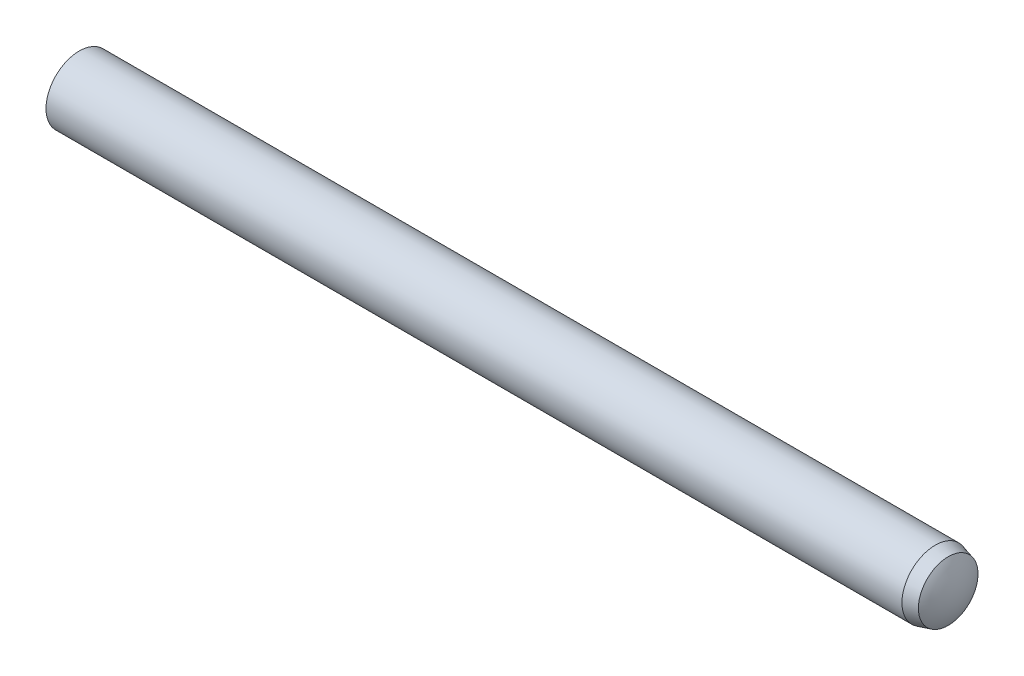
ISO-10303-21;
HEADER;
FILE_DESCRIPTION(('STEP AP214'),'2;1');
FILE_NAME('part.step','',(''),(''),'','','');
FILE_SCHEMA(('AUTOMOTIVE_DESIGN { 1 0 10303 214 1 1 1 1 }'));
ENDSEC;
DATA;
#1=APPLICATION_CONTEXT('core data for automotive mechanical design processes');
#2=APPLICATION_PROTOCOL_DEFINITION('international standard','automotive_design',2000,#1);
#3=PRODUCT_CONTEXT('',#1,'mechanical');
#4=PRODUCT('Part','Part','',(#3));
#5=PRODUCT_RELATED_PRODUCT_CATEGORY('part','',(#4));
#6=PRODUCT_DEFINITION_FORMATION('','',#4);
#7=PRODUCT_DEFINITION_CONTEXT('part definition',#1,'design');
#8=PRODUCT_DEFINITION('design','',#6,#7);
#9=PRODUCT_DEFINITION_SHAPE('','',#8);
#10=(LENGTH_UNIT() NAMED_UNIT(*) SI_UNIT(.MILLI.,.METRE.));
#11=(NAMED_UNIT(*) PLANE_ANGLE_UNIT() SI_UNIT($,.RADIAN.));
#12=(NAMED_UNIT(*) SI_UNIT($,.STERADIAN.) SOLID_ANGLE_UNIT());
#13=UNCERTAINTY_MEASURE_WITH_UNIT(LENGTH_MEASURE(1.E-05),#10,'distance_accuracy_value','');
#14=(GEOMETRIC_REPRESENTATION_CONTEXT(3) GLOBAL_UNCERTAINTY_ASSIGNED_CONTEXT((#13)) GLOBAL_UNIT_ASSIGNED_CONTEXT((#10,
#11,#12)) REPRESENTATION_CONTEXT('',''));
#15=CARTESIAN_POINT('',(0.,0.,0.));
#16=DIRECTION('',(0.,0.,1.));
#17=DIRECTION('',(1.,0.,0.));
#18=AXIS2_PLACEMENT_3D('',#15,#16,#17);
#19=CARTESIAN_POINT('',(-20.,0.,0.));
#20=DIRECTION('',(1.,0.,0.));
#21=DIRECTION('',(0.,0.,-1.));
#22=AXIS2_PLACEMENT_3D('',#19,#20,#21);
#23=CYLINDRICAL_SURFACE('',#22,1.5);
#24=CARTESIAN_POINT('',(19.025,0.,0.));
#25=DIRECTION('',(-1.,0.,0.));
#26=DIRECTION('',(0.,0.,1.));
#27=AXIS2_PLACEMENT_3D('',#24,#25,#26);
#28=CIRCLE('',#27,1.5);
#29=CARTESIAN_POINT('',(19.025,0.,1.5));
#30=VERTEX_POINT('',#29);
#31=EDGE_CURVE('E11',#30,#30,#28,.T.);
#32=ORIENTED_EDGE('',*,*,#31,.T.);
#33=EDGE_LOOP('',(#32));
#34=FACE_BOUND('',#33,.T.);
#35=CARTESIAN_POINT('',(-19.55,0.,0.));
#36=DIRECTION('',(-1.,0.,0.));
#37=DIRECTION('',(0.,0.,1.));
#38=AXIS2_PLACEMENT_3D('',#35,#36,#37);
#39=CIRCLE('',#38,1.5);
#40=CARTESIAN_POINT('',(-19.55,0.,1.5));
#41=VERTEX_POINT('',#40);
#42=EDGE_CURVE('E52',#41,#41,#39,.T.);
#43=ORIENTED_EDGE('',*,*,#42,.F.);
#44=EDGE_LOOP('',(#43));
#45=FACE_BOUND('',#44,.T.);
#46=ADVANCED_FACE('F32',(#34,#45),#23,.T.);
#47=CARTESIAN_POINT('',(19.025,0.,0.));
#48=DIRECTION('',(-1.,0.,0.));
#49=DIRECTION('',(0.,0.,1.));
#50=AXIS2_PLACEMENT_3D('',#47,#48,#49);
#51=CONICAL_SURFACE('',#50,1.5,0.261799387799146);
#52=CARTESIAN_POINT('',(19.61,0.,0.));
#53=DIRECTION('',(-1.,0.,0.));
#54=DIRECTION('',(0.,0.,1.));
#55=AXIS2_PLACEMENT_3D('',#52,#53,#54);
#56=CIRCLE('',#55,1.34324972242779);
#57=CARTESIAN_POINT('',(19.61,0.,1.34324972242779));
#58=VERTEX_POINT('',#57);
#59=EDGE_CURVE('E39',#58,#58,#56,.T.);
#60=ORIENTED_EDGE('',*,*,#59,.T.);
#61=EDGE_LOOP('',(#60));
#62=FACE_BOUND('',#61,.T.);
#63=ORIENTED_EDGE('',*,*,#31,.F.);
#64=EDGE_LOOP('',(#63));
#65=FACE_BOUND('',#64,.T.);
#66=ADVANCED_FACE('F58',(#62,#65),#51,.T.);
#67=CARTESIAN_POINT('',(17.4917694656381,0.,0.));
#68=DIRECTION('',(-1.,0.,0.));
#69=DIRECTION('',(0.,1.,0.));
#70=AXIS2_PLACEMENT_3D('',#67,#68,#69);
#71=SPHERICAL_SURFACE('',#70,2.50823053436194);
#72=CARTESIAN_POINT('',(20.,0.,0.));
#73=VERTEX_POINT('',#72);
#74=VERTEX_LOOP('',#73);
#75=FACE_BOUND('',#74,.T.);
#76=ORIENTED_EDGE('',*,*,#59,.F.);
#77=EDGE_LOOP('',(#76));
#78=FACE_BOUND('',#77,.T.);
#79=ADVANCED_FACE('F48',(#75,#78),#71,.T.);
#80=CARTESIAN_POINT('',(-17.275,0.,0.));
#81=DIRECTION('',(-1.,0.,0.));
#82=DIRECTION('',(0.,-1.,0.));
#83=AXIS2_PLACEMENT_3D('',#80,#81,#82);
#84=SPHERICAL_SURFACE('',#83,2.725);
#85=CARTESIAN_POINT('',(-20.,0.,0.));
#86=VERTEX_POINT('',#85);
#87=VERTEX_LOOP('',#86);
#88=FACE_BOUND('',#87,.T.);
#89=ORIENTED_EDGE('',*,*,#42,.T.);
#90=EDGE_LOOP('',(#89));
#91=FACE_BOUND('',#90,.T.);
#92=ADVANCED_FACE('F45',(#88,#91),#84,.T.);
#93=CLOSED_SHELL('',(#46,#66,#79,#92));
#94=MANIFOLD_SOLID_BREP('B2',#93);
#95=ADVANCED_BREP_SHAPE_REPRESENTATION('',(#18,#94),#14);
#96=SHAPE_DEFINITION_REPRESENTATION(#9,#95);
ENDSEC;
END-ISO-10303-21;
